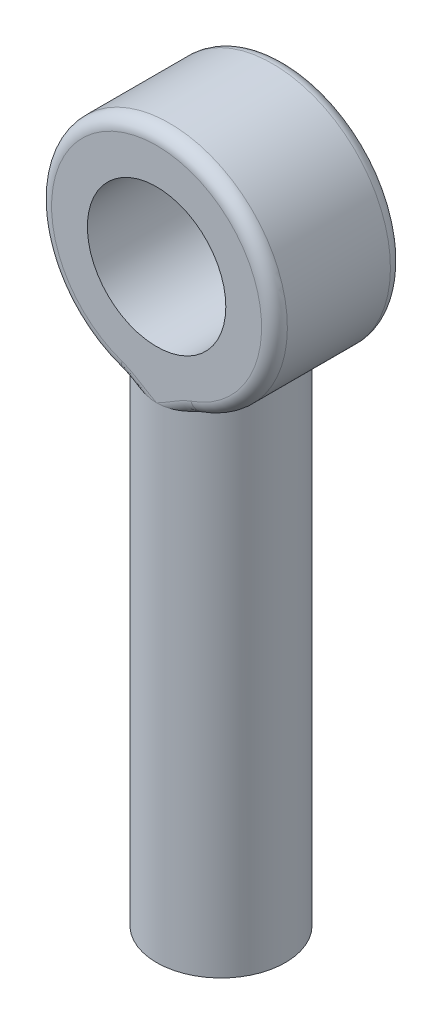
ISO-10303-21;
HEADER;
FILE_DESCRIPTION(('STEP AP214'),'2;1');
FILE_NAME('part.step','',(''),(''),'','','');
FILE_SCHEMA(('AUTOMOTIVE_DESIGN { 1 0 10303 214 1 1 1 1 }'));
ENDSEC;
DATA;
#1=APPLICATION_CONTEXT('core data for automotive mechanical design processes');
#2=APPLICATION_PROTOCOL_DEFINITION('international standard','automotive_design',2000,#1);
#3=PRODUCT_CONTEXT('',#1,'mechanical');
#4=PRODUCT('Part','Part','',(#3));
#5=PRODUCT_RELATED_PRODUCT_CATEGORY('part','',(#4));
#6=PRODUCT_DEFINITION_FORMATION('','',#4);
#7=PRODUCT_DEFINITION_CONTEXT('part definition',#1,'design');
#8=PRODUCT_DEFINITION('design','',#6,#7);
#9=PRODUCT_DEFINITION_SHAPE('','',#8);
#10=(LENGTH_UNIT() NAMED_UNIT(*) SI_UNIT(.MILLI.,.METRE.));
#11=(NAMED_UNIT(*) PLANE_ANGLE_UNIT() SI_UNIT($,.RADIAN.));
#12=(NAMED_UNIT(*) SI_UNIT($,.STERADIAN.) SOLID_ANGLE_UNIT());
#13=UNCERTAINTY_MEASURE_WITH_UNIT(LENGTH_MEASURE(1.E-05),#10,'distance_accuracy_value','');
#14=(GEOMETRIC_REPRESENTATION_CONTEXT(3) GLOBAL_UNCERTAINTY_ASSIGNED_CONTEXT((#13)) GLOBAL_UNIT_ASSIGNED_CONTEXT((#10,
#11,#12)) REPRESENTATION_CONTEXT('',''));
#15=CARTESIAN_POINT('',(0.,0.,0.));
#16=DIRECTION('',(0.,0.,1.));
#17=DIRECTION('',(1.,0.,0.));
#18=AXIS2_PLACEMENT_3D('',#15,#16,#17);
#19=CARTESIAN_POINT('',(0.,8.,0.));
#20=DIRECTION('',(0.,-1.,0.));
#21=DIRECTION('',(0.,0.,-1.));
#22=AXIS2_PLACEMENT_3D('',#19,#20,#21);
#23=CYLINDRICAL_SURFACE('',#22,1.);
#24=CARTESIAN_POINT('',(0.,0.,0.));
#25=DIRECTION('',(0.,1.,0.));
#26=DIRECTION('',(0.,0.,1.));
#27=AXIS2_PLACEMENT_3D('',#24,#25,#26);
#28=CIRCLE('',#27,1.);
#29=CARTESIAN_POINT('',(0.,0.,1.));
#30=VERTEX_POINT('',#29);
#31=EDGE_CURVE('E125',#30,#30,#28,.T.);
#32=ORIENTED_EDGE('',*,*,#31,.T.);
#33=EDGE_LOOP('',(#32));
#34=FACE_BOUND('',#33,.T.);
#35=CARTESIAN_POINT('',(0.,7.52698641016358,-1.));
#36=CARTESIAN_POINT('',(-0.051970467917206,7.52698938291042,-0.999996699192172));
#37=CARTESIAN_POINT('',(-0.103984471064199,7.52922235900575,-0.995925169987836));
#38=CARTESIAN_POINT('',(-0.206437472747701,7.53793520037049,-0.979837527700244));
#39=CARTESIAN_POINT('',(-0.256874152359671,7.5444210364042,-0.967810244999845));
#40=CARTESIAN_POINT('',(-0.354542477542119,7.56097025968291,-0.936440196531651));
#41=CARTESIAN_POINT('',(-0.401786352812405,7.57101895197488,-0.917127458906014));
#42=CARTESIAN_POINT('',(-0.492270636592457,7.59380495262617,-0.871911976068812));
#43=CARTESIAN_POINT('',(-0.535510906765449,7.60654235383875,-0.846009003260324));
#44=CARTESIAN_POINT('',(-0.620076371309741,7.63459913269445,-0.786360365241172));
#45=CARTESIAN_POINT('',(-0.661069830068739,7.65003535713016,-0.752200305728966));
#46=CARTESIAN_POINT('',(-0.737059368691457,7.681434659417,-0.67791673476889));
#47=CARTESIAN_POINT('',(-0.772049920876368,7.69739820688806,-0.637787789768385));
#48=CARTESIAN_POINT('',(-0.838463260883695,7.72985610156799,-0.548076339619698));
#49=CARTESIAN_POINT('',(-0.869212026226135,7.74625205159681,-0.497954618789555));
#50=CARTESIAN_POINT('',(-0.921723725949831,7.77570318302421,-0.392297672555958));
#51=CARTESIAN_POINT('',(-0.943493733992661,7.78876099118873,-0.336766751442518));
#52=CARTESIAN_POINT('',(-0.975890217291191,7.8087191410274,-0.225354249835977));
#53=CARTESIAN_POINT('',(-0.987132878735899,7.81595587141412,-0.169715643426276));
#54=CARTESIAN_POINT('',(-0.999985404405095,7.82425751292487,-0.0569139156552565));
#55=CARTESIAN_POINT('',(-1.00160869538649,7.82533102662681,0.000246968829507787));
#56=CARTESIAN_POINT('',(-0.995625620976603,7.82144338644309,0.105226410345113));
#57=CARTESIAN_POINT('',(-0.989363769846377,7.81736105038489,0.15316323244546));
#58=CARTESIAN_POINT('',(-0.970163088934987,7.80519470866099,0.247154754076427));
#59=CARTESIAN_POINT('',(-0.95722130153155,7.79710893048772,0.293208610145247));
#60=CARTESIAN_POINT('',(-0.924851319868638,7.77770425016732,0.3834034114977));
#61=CARTESIAN_POINT('',(-0.905287930561571,7.76631873689582,0.427480807196744));
#62=CARTESIAN_POINT('',(-0.860345668078355,7.74157543692857,0.511954127959286));
#63=CARTESIAN_POINT('',(-0.83496426678474,7.72821679374308,0.552348441905667));
#64=CARTESIAN_POINT('',(-0.774527595210986,7.69853566052023,0.634913195323332));
#65=CARTESIAN_POINT('',(-0.738582050453677,7.68207511876676,0.676384790650869));
#66=CARTESIAN_POINT('',(-0.660260443410964,7.649689743531,0.753034559801633));
#67=CARTESIAN_POINT('',(-0.617880124293626,7.63376527326243,0.788208533706892));
#68=CARTESIAN_POINT('',(-0.524438055404394,7.60299005981319,0.85347407334274));
#69=CARTESIAN_POINT('',(-0.472989964263161,7.58827749232008,0.883083288255684));
#70=CARTESIAN_POINT('',(-0.364844600395099,7.56285867798089,0.932965515524969));
#71=CARTESIAN_POINT('',(-0.308152267457337,7.5521487078926,0.953247208473617));
#72=CARTESIAN_POINT('',(-0.196730569434103,7.53680211015136,0.981985151095201));
#73=CARTESIAN_POINT('',(-0.14230416369101,7.53169559480773,0.991361207445898));
#74=CARTESIAN_POINT('',(-0.0324244358643851,7.52644937134694,1.00099165357989));
#75=CARTESIAN_POINT('',(0.0230282226244078,7.52630655865186,1.00125174499957));
#76=CARTESIAN_POINT('',(0.127684698427435,7.53076626232704,0.993068383464773));
#77=CARTESIAN_POINT('',(0.176976664506204,7.53491380638172,0.98545942536891));
#78=CARTESIAN_POINT('',(0.273458287191321,7.54687543939344,0.963157611001541));
#79=CARTESIAN_POINT('',(0.3206477292934,7.55468990152418,0.948464033740671));
#80=CARTESIAN_POINT('',(0.412885307254282,7.57352473422744,0.912162377033642));
#81=CARTESIAN_POINT('',(0.457859019409099,7.58461484566986,0.890402732666069));
#82=CARTESIAN_POINT('',(0.543637098919117,7.6090096456642,0.840783429178754));
#83=CARTESIAN_POINT('',(0.584439910073174,7.62231515596931,0.81292150533944));
#84=CARTESIAN_POINT('',(0.665543364916757,7.65166477699754,0.748350920584621));
#85=CARTESIAN_POINT('',(0.705285230165129,7.66784892826385,0.711003473358394));
#86=CARTESIAN_POINT('',(0.778238276105723,7.70018409722803,0.630323486420606));
#87=CARTESIAN_POINT('',(0.811442812978245,7.71633506487896,0.586984933349329));
#88=CARTESIAN_POINT('',(0.872827989689509,7.74808953647928,0.491555103527454));
#89=CARTESIAN_POINT('',(0.900441525904467,7.76356008097536,0.439050362311091));
#90=CARTESIAN_POINT('',(0.946172896845595,7.79027055379196,0.329074110618256));
#91=CARTESIAN_POINT('',(0.96430452026542,7.80151661864696,0.271609954750944));
#92=CARTESIAN_POINT('',(0.988746977932643,7.81694509901419,0.159231989476085));
#93=CARTESIAN_POINT('',(0.996036338284141,7.82170834999322,0.104614082687772));
#94=CARTESIAN_POINT('',(1.00149393822094,7.82525927171374,-0.00525209541912336));
#95=CARTESIAN_POINT('',(0.999669617721782,7.82405181662453,-0.0604998158397739));
#96=CARTESIAN_POINT('',(0.987902635514842,7.81645445834631,-0.162227296221264));
#97=CARTESIAN_POINT('',(0.979070365259631,7.81077414419967,-0.208897031126663));
#98=CARTESIAN_POINT('',(0.955104528961739,7.79586150542284,-0.299991443222223));
#99=CARTESIAN_POINT('',(0.939968436963116,7.78662775703616,-0.344415212437871));
#100=CARTESIAN_POINT('',(0.90281533797864,7.76496797453777,-0.432859846949563));
#101=CARTESIAN_POINT('',(0.880429556075247,7.75237937360748,-0.476684563723124));
#102=CARTESIAN_POINT('',(0.829765555623059,7.72561104285569,-0.560249707394681));
#103=CARTESIAN_POINT('',(0.801484193630807,7.71143046608312,-0.599987938486107));
#104=CARTESIAN_POINT('',(0.734753030294491,7.68046475819649,-0.680649048253896));
#105=CARTESIAN_POINT('',(0.695407817481397,7.66361506604281,-0.720810465850663));
#106=CARTESIAN_POINT('',(0.610232944498177,7.63109939708826,-0.794215012650451));
#107=CARTESIAN_POINT('',(0.564398773118372,7.61543425552505,-0.827453288727932));
#108=CARTESIAN_POINT('',(0.465536466667903,7.58640284033048,-0.886966934416858));
#109=CARTESIAN_POINT('',(0.412323624258422,7.57312728913857,-0.912982379072167));
#110=CARTESIAN_POINT('',(0.301378664188837,7.55108881005497,-0.955340166973844));
#111=CARTESIAN_POINT('',(0.243658692040336,7.54231420603317,-0.97170755536368));
#112=CARTESIAN_POINT('',(0.154384977744775,7.53325124269856,-0.988495801048371));
#113=CARTESIAN_POINT('',(0.12371976725997,7.53091106263287,-0.992800711559536));
#114=CARTESIAN_POINT('',(0.062041542368569,7.52777776444402,-0.99855378622909));
#115=CARTESIAN_POINT('',(0.0310285304389451,7.5269846353101,-1.00000197071953));
#116=CARTESIAN_POINT('',(0.,7.52698641016358,-1.));
#117=B_SPLINE_CURVE_WITH_KNOTS('',3,(#35,#36,#37,#38,#39,#40,#41,#42,#43,#44,#45,#46,#47,#48,
#49,#50,#51,#52,#53,#54,#55,#56,#57,#58,#59,#60,#61,#62,#63,#64,#65,#66,#67,#68,#69,#70,#71,#72,
#73,#74,#75,#76,#77,#78,#79,#80,#81,#82,#83,#84,#85,#86,#87,#88,#89,#90,#91,#92,#93,#94,#95,#96,
#97,#98,#99,#100,#101,#102,#103,#104,#105,#106,#107,#108,#109,#110,#111,#112,#113,#114,#115,
#116),.UNSPECIFIED.,.T.,.F.,(4,2,2,2,2,2,2,2,2,2,2,2,2,2,2,2,2,2,2,2,2,2,2,2,2,2,2,2,2,2,2,2,2,
2,2,2,2,2,2,2,4),(0.,0.155786430819204,0.311792046230735,0.467161563596198,0.622536447450762,
0.788508029006407,0.954631631892104,1.13684873456602,1.31892200713352,1.48951276710349,
1.65986535959731,1.80473150579211,1.94966184830995,2.09775024883125,2.24590312102722,
2.41707022348151,2.58835105642325,2.77082510381357,2.95312898766059,3.1185813126271,
3.28393015257035,3.43337967802993,3.58284441591883,3.73575413342211,3.88872069627475,
4.05867144960494,4.22879404054062,4.41173588030745,4.59441093917223,4.75931125979861,
4.9240769867412,5.0669598655619,5.20990005305148,5.36171228414045,5.51360566744169,
5.68891075036996,5.86433831170484,6.04543884344395,6.22606716671143,6.31907880598098,
6.41208978326041),.UNSPECIFIED.);
#118=CARTESIAN_POINT('',(0.,7.52698641016358,-1.));
#119=VERTEX_POINT('',#118);
#120=CARTESIAN_POINT('',(-0.600000000000304,7.62811701872746,-0.8));
#121=VERTEX_POINT('',#120);
#122=EDGE_CURVE('E106',#119,#121,#117,.T.);
#123=ORIENTED_EDGE('',*,*,#122,.F.);
#124=CARTESIAN_POINT('',(0.6,7.62811701872736,-0.8));
#125=VERTEX_POINT('',#124);
#126=EDGE_CURVE('E108',#125,#119,#117,.T.);
#127=ORIENTED_EDGE('',*,*,#126,.F.);
#128=CARTESIAN_POINT('',(0.600000000000029,7.62811701872736,0.8));
#129=VERTEX_POINT('',#128);
#130=EDGE_CURVE('E124',#129,#125,#117,.T.);
#131=ORIENTED_EDGE('',*,*,#130,.F.);
#132=CARTESIAN_POINT('',(0.,7.52698641016318,1.00000000000073));
#133=VERTEX_POINT('',#132);
#134=EDGE_CURVE('E116',#133,#129,#117,.T.);
#135=ORIENTED_EDGE('',*,*,#134,.F.);
#136=CARTESIAN_POINT('',(-0.600000000000587,7.62811701872756,0.8));
#137=VERTEX_POINT('',#136);
#138=EDGE_CURVE('E126',#137,#133,#117,.T.);
#139=ORIENTED_EDGE('',*,*,#138,.F.);
#140=EDGE_CURVE('E111',#121,#137,#117,.T.);
#141=ORIENTED_EDGE('',*,*,#140,.F.);
#142=EDGE_LOOP('',(#123,#127,#131,#135,#139,#141));
#143=FACE_BOUND('',#142,.T.);
#144=ADVANCED_FACE('F34',(#34,#143),#23,.T.);
#145=CARTESIAN_POINT('',(0.,0.,0.));
#146=DIRECTION('',(0.,1.,0.));
#147=DIRECTION('',(0.,0.,1.));
#148=AXIS2_PLACEMENT_3D('',#145,#146,#147);
#149=PLANE('',#148);
#150=ORIENTED_EDGE('',*,*,#31,.F.);
#151=EDGE_LOOP('',(#150));
#152=FACE_BOUND('',#151,.T.);
#153=ADVANCED_FACE('F296',(#152),#149,.F.);
#154=CARTESIAN_POINT('',(0.,9.35742827759776,1.));
#155=DIRECTION('',(0.,0.,-1.));
#156=DIRECTION('',(-1.,0.,0.));
#157=AXIS2_PLACEMENT_3D('',#154,#155,#156);
#158=CYLINDRICAL_SURFACE('',#157,1.83044186743419);
#159=ORIENTED_EDGE('',*,*,#130,.T.);
#160=CARTESIAN_POINT('',(0.,9.35742827759776,-0.8));
#161=DIRECTION('',(0.,0.,1.));
#162=DIRECTION('',(1.,0.,0.));
#163=AXIS2_PLACEMENT_3D('',#160,#161,#162);
#164=CIRCLE('',#163,1.83044186743419);
#165=EDGE_CURVE('E100',#125,#121,#164,.T.);
#166=ORIENTED_EDGE('',*,*,#165,.T.);
#167=ORIENTED_EDGE('',*,*,#140,.T.);
#168=CARTESIAN_POINT('',(0.,9.35742827759776,0.8));
#169=DIRECTION('',(0.,0.,1.));
#170=DIRECTION('',(1.,0.,0.));
#171=AXIS2_PLACEMENT_3D('',#168,#169,#170);
#172=CIRCLE('',#171,1.83044186743419);
#173=EDGE_CURVE('E114',#137,#129,#172,.F.);
#174=ORIENTED_EDGE('',*,*,#173,.T.);
#175=EDGE_LOOP('',(#159,#166,#167,#174));
#176=FACE_BOUND('',#175,.T.);
#177=ADVANCED_FACE('F141',(#176),#158,.T.);
#178=CARTESIAN_POINT('',(0.,9.35742827759776,1.));
#179=DIRECTION('',(0.,0.,1.));
#180=DIRECTION('',(1.,0.,0.));
#181=AXIS2_PLACEMENT_3D('',#178,#179,#180);
#182=PLANE('',#181);
#183=CARTESIAN_POINT('',(0.,7.52698641016358,1.));
#184=CARTESIAN_POINT('',(-9.77387525553122E-12,7.52698641016358,1.));
#185=CARTESIAN_POINT('',(-1.95477505110625E-11,7.52698641016357,1.));
#186=CARTESIAN_POINT('',(-0.00168654811929439,7.52782968043313,1.));
#187=CARTESIAN_POINT('',(-0.00189552876347099,7.52740787804781,1.));
#188=CARTESIAN_POINT('',(-0.00210450064190155,7.52698614702818,1.00000019812365));
#189=CARTESIAN_POINT('',(-0.003371641051788,7.52867587043769,1.));
#190=CARTESIAN_POINT('',(-0.00379147665539922,7.52783270798792,1.));
#191=CARTESIAN_POINT('',(-0.00421124223419119,7.5269895936486,0.999993648469634));
#192=CARTESIAN_POINT('',(-0.0348248089523387,7.54453739401447,1.));
#193=CARTESIAN_POINT('',(-0.0392264716648263,7.53583202088697,1.));
#194=CARTESIAN_POINT('',(-0.0436072753622978,7.52712335111166,0.999744978863896));
#195=CARTESIAN_POINT('',(-0.0641457199831848,7.56044468499952,1.));
#196=CARTESIAN_POINT('',(-0.0730439225046229,7.54446138067876,1.));
#197=CARTESIAN_POINT('',(-0.0815480134024022,7.52841084736441,0.997395782116366));
#198=CARTESIAN_POINT('',(-0.122130508356827,7.5934218654303,1.));
#199=CARTESIAN_POINT('',(-0.140279184462998,7.56261878902605,1.));
#200=CARTESIAN_POINT('',(-0.157092925196516,7.53334805171312,0.98831670074712));
#201=CARTESIAN_POINT('',(-0.150794016112644,7.61049238841147,1.));
#202=CARTESIAN_POINT('',(-0.174077472313793,7.57226195588071,1.));
#203=CARTESIAN_POINT('',(-0.19469690272043,7.53699905640594,0.981584411593583));
#204=CARTESIAN_POINT('',(-0.207955551314903,7.64508589936665,1.));
#205=CARTESIAN_POINT('',(-0.241359514145556,7.59116211471078,1.));
#206=CARTESIAN_POINT('',(-0.26825597666676,7.54637438933696,0.964084745545151));
#207=CARTESIAN_POINT('',(-0.236452863783847,7.66261004954365,1.));
#208=CARTESIAN_POINT('',(-0.275230550478996,7.60051981532386,1.));
#209=CARTESIAN_POINT('',(-0.304206008755181,7.55210466248382,0.953305795610457));
#210=CARTESIAN_POINT('',(-0.29366651382341,7.69727880907923,1.));
#211=CARTESIAN_POINT('',(-0.342423906888233,7.61727959692922,1.));
#212=CARTESIAN_POINT('',(-0.373046172815186,7.56505820899834,0.928538193829815));
#213=CARTESIAN_POINT('',(-0.322382756559033,7.71442357147172,1.));
#214=CARTESIAN_POINT('',(-0.376124344409935,7.62470803509856,1.));
#215=CARTESIAN_POINT('',(-0.405937556356567,7.57228086776331,0.914550863017171));
#216=CARTESIAN_POINT('',(-0.381348153733825,7.74779752720824,1.));
#217=CARTESIAN_POINT('',(-0.44354852270475,7.63584254931148,1.));
#218=CARTESIAN_POINT('',(-0.468729776010433,7.58771617245239,0.88404813335428));
#219=CARTESIAN_POINT('',(-0.41161774644579,7.76399154551372,1.));
#220=CARTESIAN_POINT('',(-0.477564871358947,7.6392877686049,1.));
#221=CARTESIAN_POINT('',(-0.498531194787169,7.59594960066312,0.867476679472627));
#222=CARTESIAN_POINT('',(-0.473350541782452,7.79354464146294,1.));
#223=CARTESIAN_POINT('',(-0.543118356194995,7.63945870966179,1.));
#224=CARTESIAN_POINT('',(-0.553591018118684,7.61247216690315,0.833412829832937));
#225=CARTESIAN_POINT('',(-0.504805682745556,7.80691982299702,1.));
#226=CARTESIAN_POINT('',(-0.574903184937714,7.63573900558596,1.));
#227=CARTESIAN_POINT('',(-0.578875096254024,7.62076069301944,0.815926419772173));
#228=CARTESIAN_POINT('',(-0.559234734289879,7.82556650539757,1.));
#229=CARTESIAN_POINT('',(-0.62262974391208,7.62127719296923,1.));
#230=CARTESIAN_POINT('',(-0.617690060355261,7.6342754531923,0.78667175272099));
#231=CARTESIAN_POINT('',(-0.581766569799328,7.83206372059331,1.));
#232=CARTESIAN_POINT('',(-0.640758326862257,7.61257261705014,1.));
#233=CARTESIAN_POINT('',(-0.632417136396313,7.63964530302853,0.774833874504411));
#234=CARTESIAN_POINT('',(-0.627742213328245,7.84194824275603,1.));
#235=CARTESIAN_POINT('',(-0.671223263650764,7.58966290015831,1.));
#236=CARTESIAN_POINT('',(-0.659841298964129,7.64999179562984,0.751624526063452));
#237=CARTESIAN_POINT('',(-0.651193374733674,7.84530017670787,1.));
#238=CARTESIAN_POINT('',(-0.683076902154961,7.57493879075499,1.));
#239=CARTESIAN_POINT('',(-0.672514000048021,7.65496340390726,0.740259703282654));
#240=CARTESIAN_POINT('',(-0.674915369831935,7.84652303426865,1.));
#241=CARTESIAN_POINT('',(-0.689015266115583,7.55771879285645,1.));
#242=CARTESIAN_POINT('',(-0.684041077564358,7.65960370904863,0.729442393869346));
#243=(BOUNDED_SURFACE() B_SPLINE_SURFACE(3,2,((#183,#184,#185),(#186,#187,#188),(#189,#190,
#191),(#192,#193,#194),(#195,#196,#197),(#198,#199,#200),(#201,#202,#203),(#204,#205,#206),
(#207,#208,#209),(#210,#211,#212),(#213,#214,#215),(#216,#217,#218),(#219,#220,#221),(#222,#223,
#224),(#225,#226,#227),(#228,#229,#230),(#231,#232,#233),(#234,#235,#236),(#237,#238,#239),
(#240,#241,#242)),.UNSPECIFIED.,.F.,.F.,.F.) B_SPLINE_SURFACE_WITH_KNOTS((4,2,2,2,2,2,2,2,2,4),
(3,3),(0.,0.00565686259358751,0.105678377575268,0.205754809902558,0.306119658371052,
0.40644325610641,0.509363060985981,0.611677917776606,0.681831176715021,0.752764268849145),(0.,
1.),.UNSPECIFIED.) GEOMETRIC_REPRESENTATION_ITEM() RATIONAL_B_SPLINE_SURFACE(((1.,1.,1.),(1.,
1.00000006196318,1.),(1.,0.999991747522638,1.),(1.,0.999679360102642,1.),(1.,0.996755271709692,
1.),(1.,0.98530487003735,1.),(1.,0.976775481708042,1.),(1.,0.954117000821686,1.),(1.,
0.939971840990942,1.),(1.,0.906435465402421,1.),(1.,0.887046408203926,1.),(1.,0.842981160016293,
1.),(1.,0.818181131453455,1.),(1.,0.764363520458414,1.),(1.,0.735371585034437,1.),(1.,
0.683462075146073,1.),(1.,0.661499762190992,1.),(1.,0.616112203299446,1.),(1.,0.592673409050226,
1.),(1.,0.568864712996651,1.))) REPRESENTATION_ITEM('') SURFACE());
#244=CARTESIAN_POINT('',(-0.674915369831935,7.84652303426865,1.));
#245=CARTESIAN_POINT('',(-0.651193374733674,7.84530017670787,1.));
#246=CARTESIAN_POINT('',(-0.627742213328245,7.84194824275603,1.));
#247=CARTESIAN_POINT('',(-0.581766569799328,7.83206372059331,1.));
#248=CARTESIAN_POINT('',(-0.559234734289879,7.82556650539757,1.));
#249=CARTESIAN_POINT('',(-0.504805682745556,7.80691982299702,1.));
#250=CARTESIAN_POINT('',(-0.473350541782451,7.79354464146294,1.));
#251=CARTESIAN_POINT('',(-0.41161774644579,7.76399154551372,1.));
#252=CARTESIAN_POINT('',(-0.381348153733825,7.74779752720824,1.));
#253=CARTESIAN_POINT('',(-0.322382756559033,7.71442357147172,1.));
#254=CARTESIAN_POINT('',(-0.29366651382341,7.69727880907923,1.));
#255=CARTESIAN_POINT('',(-0.236452863783847,7.66261004954365,1.));
#256=CARTESIAN_POINT('',(-0.207955551314903,7.64508589936665,1.));
#257=CARTESIAN_POINT('',(-0.150794016112644,7.61049238841147,1.));
#258=CARTESIAN_POINT('',(-0.122130508356827,7.5934218654303,1.));
#259=CARTESIAN_POINT('',(-0.0641457199831847,7.56044468499952,1.));
#260=CARTESIAN_POINT('',(-0.0348248089523386,7.54453739401447,1.));
#261=CARTESIAN_POINT('',(-0.003371641051788,7.52867587043769,1.));
#262=CARTESIAN_POINT('',(-0.00168654811929439,7.52782968043313,1.));
#263=CARTESIAN_POINT('',(0.,7.52698641016358,1.));
#264=B_SPLINE_CURVE_WITH_KNOTS('',3,(#244,#245,#246,#247,#248,#249,#250,#251,#252,#253,#254,
#255,#256,#257,#258,#259,#260,#261,#262,#263),.UNSPECIFIED.,.F.,.F.,(4,2,2,2,2,2,2,2,2,4),(0.,
0.070933092134124,0.141086351072539,0.243401207863163,0.346321012742735,0.446644610478093,
0.547009458946586,0.647085891273877,0.747107406255557,0.752764268849145),.UNSPECIFIED.);
#265=CARTESIAN_POINT('',(-0.534442058973068,7.81706716127277,1.));
#266=VERTEX_POINT('',#265);
#267=EDGE_CURVE('E119',#266,#133,#264,.T.);
#268=ORIENTED_EDGE('',*,*,#267,.T.);
#269=CARTESIAN_POINT('',(0.628555051553443,7.84152123020113,1.));
#270=CARTESIAN_POINT('',(0.669869099887204,7.58861173664064,1.));
#271=CARTESIAN_POINT('',(0.659834005704115,7.65004291296046,0.751412852221154));
#272=CARTESIAN_POINT('',(0.612095341844448,7.83881532849146,1.));
#273=CARTESIAN_POINT('',(0.661035211339228,7.59805414532398,1.));
#274=CARTESIAN_POINT('',(0.650653755869616,7.64649805458552,0.759475338512103));
#275=CARTESIAN_POINT('',(0.595809699545001,7.83524648976496,1.));
#276=CARTESIAN_POINT('',(0.65009043626449,7.60618472575125,1.));
#277=CARTESIAN_POINT('',(0.640923229415198,7.6428251706919,0.767719983534419));
#278=CARTESIAN_POINT('',(0.563648955913855,7.82671369217039,1.));
#279=CARTESIAN_POINT('',(0.625666647491144,7.61942605952106,1.));
#280=CARTESIAN_POINT('',(0.620402242248302,7.63529899239658,0.784394115593078));
#281=CARTESIAN_POINT('',(0.547772894643065,7.82175339612661,1.));
#282=CARTESIAN_POINT('',(0.612285851389527,7.62469271791165,1.));
#283=CARTESIAN_POINT('',(0.609614612088566,7.63144619349806,0.792823064471747));
#284=CARTESIAN_POINT('',(0.501109882996578,7.80538478026958,1.));
#285=CARTESIAN_POINT('',(0.57111042688971,7.63622223453405,1.));
#286=CARTESIAN_POINT('',(0.57592851768692,7.61979794462052,0.817976060634369));
#287=CARTESIAN_POINT('',(0.47088438322166,7.79240650336457,1.));
#288=CARTESIAN_POINT('',(0.540470003262296,7.63954683285599,1.));
#289=CARTESIAN_POINT('',(0.551481089803841,7.61182262029329,0.83477131174122));
#290=CARTESIAN_POINT('',(0.403636851983783,7.76010948859778,1.));
#291=CARTESIAN_POINT('',(0.469569240461098,7.6391464744309,1.));
#292=CARTESIAN_POINT('',(0.491338056720739,7.593816206447,0.871861764496758));
#293=CARTESIAN_POINT('',(0.367000670734485,7.74002620394324,1.));
#294=CARTESIAN_POINT('',(0.427807440144408,7.634019791082,1.));
#295=CARTESIAN_POINT('',(0.45439130558824,7.58381559372028,0.891867364226568));
#296=CARTESIAN_POINT('',(0.312797058376754,7.70861365868946,1.));
#297=CARTESIAN_POINT('',(0.36435163613661,7.62193185845425,1.));
#298=CARTESIAN_POINT('',(0.394699983119227,7.56992964669999,0.919073814719343));
#299=CARTESIAN_POINT('',(0.294842973168928,7.69792090266645,1.));
#300=CARTESIAN_POINT('',(0.343379883685246,7.61729061364879,1.));
#301=CARTESIAN_POINT('',(0.374076343662265,7.56548432259284,0.927680279776969));
#302=CARTESIAN_POINT('',(0.259050913470113,7.67634177559885,1.));
#303=CARTESIAN_POINT('',(0.301425383194692,7.60716924139202,1.));
#304=CARTESIAN_POINT('',(0.331568189901006,7.55713790515118,0.943702890339811));
#305=CARTESIAN_POINT('',(0.241212935065435,7.665455411127,1.));
#306=CARTESIAN_POINT('',(0.280352759082635,7.60168697127158,1.));
#307=CARTESIAN_POINT('',(0.309683718343934,7.55323679338103,0.951119076167994));
#308=CARTESIAN_POINT('',(0.205464983526913,7.64364218408839,1.));
#309=CARTESIAN_POINT('',(0.238237874733813,7.59029248040212,1.));
#310=CARTESIAN_POINT('',(0.26494991823239,7.54612844744727,0.964538459857571));
#311=CARTESIAN_POINT('',(0.18755500606375,7.6327153325521,1.));
#312=CARTESIAN_POINT('',(0.217097668940553,7.58436015109117,1.));
#313=CARTESIAN_POINT('',(0.242097100176414,7.54292403307181,0.970535923942568));
#314=CARTESIAN_POINT('',(0.151623040651832,7.61105051863947,1.));
#315=CARTESIAN_POINT('',(0.17485771107591,7.5724549866071,1.));
#316=CARTESIAN_POINT('',(0.195684577571796,7.53733147079898,0.980949054992624));
#317=CARTESIAN_POINT('',(0.13360106565931,7.60031253494518,1.));
#318=CARTESIAN_POINT('',(0.153663870479507,7.5664563489103,1.));
#319=CARTESIAN_POINT('',(0.172124953624748,7.53494323021009,0.985364901582144));
#320=CARTESIAN_POINT('',(0.0973402687596496,7.57923166355504,1.));
#321=CARTESIAN_POINT('',(0.111391477996623,7.55476788144326,1.));
#322=CARTESIAN_POINT('',(0.124778798405164,7.53108792500822,0.992476001736331));
#323=CARTESIAN_POINT('',(0.0791015920400216,7.56888852894856,1.));
#324=CARTESIAN_POINT('',(0.0902170781884099,7.54904886460023,1.));
#325=CARTESIAN_POINT('',(0.100992420957308,7.52962027555825,0.995172347690768));
#326=CARTESIAN_POINT('',(0.0515111806738347,7.5537986298793,1.));
#327=CARTESIAN_POINT('',(0.0584899138459818,7.54089873607438,1.));
#328=CARTESIAN_POINT('',(0.0653784732084564,7.52811552257373,0.997931470133008));
#329=CARTESIAN_POINT('',(0.0422753392407157,7.54883930922075,1.));
#330=CARTESIAN_POINT('',(0.047920679713526,7.53825308552585,1.));
#331=CARTESIAN_POINT('',(0.0535177080378043,7.52773005723563,0.998636946909721));
#332=CARTESIAN_POINT('',(0.0283759614733865,7.54148520955515,1.));
#333=CARTESIAN_POINT('',(0.0320898514060846,7.53439538342673,1.));
#334=CARTESIAN_POINT('',(0.0357897114032028,7.5273254034235,0.999377504615478));
#335=CARTESIAN_POINT('',(0.0237351059120529,7.53904792465274,1.));
#336=CARTESIAN_POINT('',(0.0268169409056246,7.53312795846489,1.));
#337=CARTESIAN_POINT('',(0.0298907445538254,7.52721944232952,0.99957141522932));
#338=CARTESIAN_POINT('',(0.0144033710811724,7.53427079366113,1.));
#339=CARTESIAN_POINT('',(0.0162434098181091,7.53066720284919,1.));
#340=CARTESIAN_POINT('',(0.0180806810159105,7.52706496287211,0.99985443278523));
#341=CARTESIAN_POINT('',(0.00971249068806815,7.53193094976626,1.));
#342=CARTESIAN_POINT('',(0.0109414009855989,7.52947352246685,1.));
#343=CARTESIAN_POINT('',(0.0121695840573491,7.52701644580161,0.999943537368331));
#344=CARTESIAN_POINT('',(0.00421753656331799,7.52909211202889,1.));
#345=CARTESIAN_POINT('',(0.00474245354369065,7.52804259279801,1.));
#346=CARTESIAN_POINT('',(0.00526732508419899,7.52699313051949,0.999986974183062));
#347=CARTESIAN_POINT('',(0.00338086400078482,7.52865716016743,1.));
#348=CARTESIAN_POINT('',(0.00379893486035577,7.52782381909124,1.));
#349=CARTESIAN_POINT('',(0.00421698321035026,7.52699050639027,0.999991904523076));
#350=CARTESIAN_POINT('',(0.00169928069971397,7.52780400618542,1.));
#351=CARTESIAN_POINT('',(0.00190611079068449,7.52739554964759,1.));
#352=CARTESIAN_POINT('',(0.0021129324441241,7.52698709112924,0.9999984351803));
#353=CARTESIAN_POINT('',(0.000854371331804979,7.52738580133535,1.));
#354=CARTESIAN_POINT('',(0.000956798294787761,7.52718605048091,1.));
#355=CARTESIAN_POINT('',(0.00105922413090796,7.52698629969751,1.00000003604235));
#356=CARTESIAN_POINT('',(0.,7.52698641016358,1.));
#357=CARTESIAN_POINT('',(0.,7.52698641016358,1.));
#358=CARTESIAN_POINT('',(0.,7.52698641016358,1.));
#359=(BOUNDED_SURFACE() B_SPLINE_SURFACE(3,2,((#269,#270,#271),(#272,#273,#274),(#275,#276,
#277),(#278,#279,#280),(#281,#282,#283),(#284,#285,#286),(#287,#288,#289),(#290,#291,#292),
(#293,#294,#295),(#296,#297,#298),(#299,#300,#301),(#302,#303,#304),(#305,#306,#307),(#308,#309,
#310),(#311,#312,#313),(#314,#315,#316),(#317,#318,#319),(#320,#321,#322),(#323,#324,#325),
(#326,#327,#328),(#329,#330,#331),(#332,#333,#334),(#335,#336,#337),(#338,#339,#340),(#341,#342,
#343),(#344,#345,#346),(#347,#348,#349),(#350,#351,#352),(#353,#354,#355),(#356,#357,#358)),
.UNSPECIFIED.,.F.,.F.,.F.) B_SPLINE_SURFACE_WITH_KNOTS((4,2,2,2,2,2,2,2,2,2,2,2,2,2,4),(3,3),
(0.,0.0499723442531492,0.0998143579137563,0.198275267045597,0.323500216812856,0.386193523184419,
0.448884705252894,0.511825083443753,0.574758311221119,0.637651517913281,0.669100172134599,
0.68482535596104,0.700550893721971,0.703379694985842,0.706208033301766),(0.,1.),
.UNSPECIFIED.) GEOMETRIC_REPRESENTATION_ITEM() RATIONAL_B_SPLINE_SURFACE(((1.,0.615253387392433,
1.),(1.,0.631637333315181,1.),(1.,0.647726472322365,1.),(1.,0.679138445216574,1.),(1.,
0.69446316823156,1.),(1.,0.738787582311972,1.),(1.,0.766544841805808,1.),(1.,0.825065317428096,
1.),(1.,0.85459468805431,1.),(1.,0.893224564717343,1.),(1.,0.905163022376859,1.),(1.,
0.927025791536372,1.),(1.,0.93695017127009,1.),(1.,0.954686073975649,1.),(1.,0.962489041576831,
1.),(1.,0.975918783091008,1.),(1.,0.981545804132263,1.),(1.,0.9905608146998,1.),(1.,
0.993950225816285,1.),(1.,0.997411438447864,1.),(1.,0.998294694322293,1.),(1.,0.99922173880579,
1.),(1.,0.999464448271153,1.),(1.,0.999817732924066,1.),(1.,0.999928305137481,1.),(1.,
0.999983432824789,1.),(1.,0.999989771517926,1.),(1.,0.999998150098951,1.),(1.,1.00000019069019,
1.),(1.,1.,1.))) REPRESENTATION_ITEM('') SURFACE());
#360=CARTESIAN_POINT('',(0.628555051553443,7.84152123020113,1.));
#361=CARTESIAN_POINT('',(0.612095341844448,7.83881532849146,1.));
#362=CARTESIAN_POINT('',(0.595809699545001,7.83524648976496,1.));
#363=CARTESIAN_POINT('',(0.563648955913855,7.82671369217039,1.));
#364=CARTESIAN_POINT('',(0.547772894643065,7.82175339612661,1.));
#365=CARTESIAN_POINT('',(0.501109882996578,7.80538478026958,1.));
#366=CARTESIAN_POINT('',(0.47088438322166,7.79240650336457,1.));
#367=CARTESIAN_POINT('',(0.403636851983783,7.76010948859778,1.));
#368=CARTESIAN_POINT('',(0.367000670734485,7.74002620394324,1.));
#369=CARTESIAN_POINT('',(0.312797058376754,7.70861365868946,1.));
#370=CARTESIAN_POINT('',(0.294842973168928,7.69792090266645,1.));
#371=CARTESIAN_POINT('',(0.259050913470113,7.67634177559886,1.));
#372=CARTESIAN_POINT('',(0.241212935065435,7.665455411127,1.));
#373=CARTESIAN_POINT('',(0.205464983526913,7.64364218408839,1.));
#374=CARTESIAN_POINT('',(0.18755500606375,7.6327153325521,1.));
#375=CARTESIAN_POINT('',(0.151623040651832,7.61105051863947,1.));
#376=CARTESIAN_POINT('',(0.13360106565931,7.60031253494518,1.));
#377=CARTESIAN_POINT('',(0.0973402687596496,7.57923166355504,1.));
#378=CARTESIAN_POINT('',(0.0791015920400216,7.56888852894856,1.));
#379=CARTESIAN_POINT('',(0.0515111806738347,7.5537986298793,1.));
#380=CARTESIAN_POINT('',(0.0422753392407157,7.54883930922075,1.));
#381=CARTESIAN_POINT('',(0.0283759614733865,7.54148520955515,1.));
#382=CARTESIAN_POINT('',(0.0237351059120529,7.53904792465274,1.));
#383=CARTESIAN_POINT('',(0.0144033710811724,7.53427079366113,1.));
#384=CARTESIAN_POINT('',(0.00971249068806813,7.53193094976626,1.));
#385=CARTESIAN_POINT('',(0.00421753656331799,7.52909211202889,1.));
#386=CARTESIAN_POINT('',(0.00338086400078483,7.52865716016743,1.));
#387=CARTESIAN_POINT('',(0.00169928069971398,7.52780400618542,1.));
#388=CARTESIAN_POINT('',(0.000854371331804991,7.52738580133535,1.));
#389=CARTESIAN_POINT('',(0.,7.52698641016358,1.));
#390=B_SPLINE_CURVE_WITH_KNOTS('',3,(#360,#361,#362,#363,#364,#365,#366,#367,#368,#369,#370,
#371,#372,#373,#374,#375,#376,#377,#378,#379,#380,#381,#382,#383,#384,#385,#386,#387,#388,#389),
.UNSPECIFIED.,.F.,.F.,(4,2,2,2,2,2,2,2,2,2,2,2,2,2,4),(0.,0.0499723442531492,0.0998143579137563,
0.198275267045597,0.323500216812856,0.386193523184419,0.448884705252894,0.511825083443753,
0.574758311221119,0.637651517913281,0.669100172134599,0.68482535596104,0.700550893721971,
0.703379694985842,0.706208033301766),.UNSPECIFIED.);
#391=CARTESIAN_POINT('',(0.534442058972261,7.81706716127349,1.));
#392=VERTEX_POINT('',#391);
#393=EDGE_CURVE('E11',#133,#392,#390,.F.);
#394=ORIENTED_EDGE('',*,*,#393,.T.);
#395=CARTESIAN_POINT('',(0.,9.35742827759776,1.));
#396=DIRECTION('',(0.,0.,1.));
#397=DIRECTION('',(1.,0.,0.));
#398=AXIS2_PLACEMENT_3D('',#395,#396,#397);
#399=CIRCLE('',#398,1.63044186743419);
#400=EDGE_CURVE('E49',#392,#266,#399,.T.);
#401=ORIENTED_EDGE('',*,*,#400,.T.);
#402=EDGE_LOOP('',(#268,#394,#401));
#403=FACE_BOUND('',#402,.T.);
#404=CARTESIAN_POINT('',(0.,9.35742827759776,1.));
#405=DIRECTION('',(0.,0.,1.));
#406=DIRECTION('',(1.,0.,0.));
#407=AXIS2_PLACEMENT_3D('',#404,#405,#406);
#408=CIRCLE('',#407,1.07469218975854);
#409=CARTESIAN_POINT('',(1.07469218975854,9.35742827759776,1.));
#410=VERTEX_POINT('',#409);
#411=EDGE_CURVE('E128',#410,#410,#408,.T.);
#412=ORIENTED_EDGE('',*,*,#411,.F.);
#413=EDGE_LOOP('',(#412));
#414=FACE_BOUND('',#413,.T.);
#415=ADVANCED_FACE('F236',(#403,#414),#182,.T.);
#416=CARTESIAN_POINT('',(0.,9.35742827759776,-1.));
#417=DIRECTION('',(0.,0.,1.));
#418=DIRECTION('',(1.,0.,0.));
#419=AXIS2_PLACEMENT_3D('',#416,#417,#418);
#420=PLANE('',#419);
#421=CARTESIAN_POINT('',(0.,7.52698641016358,-1.));
#422=CARTESIAN_POINT('',(9.77478722877171E-12,7.52698641016357,-1.));
#423=CARTESIAN_POINT('',(1.95495744575439E-11,7.52698641016357,-1.));
#424=CARTESIAN_POINT('',(0.00168654811929203,7.52782968043314,-1.));
#425=CARTESIAN_POINT('',(0.00189552876470077,7.52740787804784,-1.));
#426=CARTESIAN_POINT('',(0.00210450064425241,7.52698614702808,-1.00000019812386));
#427=CARTESIAN_POINT('',(0.00337164105178573,7.5286758704377,-1.));
#428=CARTESIAN_POINT('',(0.00379147665792393,7.52783270798795,-1.));
#429=CARTESIAN_POINT('',(0.00421124223913877,7.52698959364851,-0.999993648469816));
#430=CARTESIAN_POINT('',(0.0348248089547702,7.5445373940156,-1.));
#431=CARTESIAN_POINT('',(0.0392264716953246,7.53583202088721,-1.));
#432=CARTESIAN_POINT('',(0.0436072754222734,7.52712335111376,-0.999744978859792));
#433=CARTESIAN_POINT('',(0.0641457199886597,7.56044468500068,-1.));
#434=CARTESIAN_POINT('',(0.0730439225830398,7.54446138067235,-1.));
#435=CARTESIAN_POINT('',(0.0815480135736699,7.52841084740056,-0.99739578204536));
#436=CARTESIAN_POINT('',(0.122130508368884,7.59342186543528,-1.));
#437=CARTESIAN_POINT('',(0.140279184401801,7.56261878903453,-1.));
#438=CARTESIAN_POINT('',(0.157092925056607,7.53334805167901,-0.988316700814385));
#439=CARTESIAN_POINT('',(0.150794016128192,7.61049238842033,-1.));
#440=CARTESIAN_POINT('',(0.174077472034542,7.57226195590376,-1.));
#441=CARTESIAN_POINT('',(0.194696902157732,7.53699905626763,-0.981584411865872));
#442=CARTESIAN_POINT('',(0.207955551330655,7.64508589937673,-1.));
#443=CARTESIAN_POINT('',(0.241359514498104,7.59116211470549,-1.));
#444=CARTESIAN_POINT('',(0.26825597727233,7.54637438948092,-0.964084745262264));
#445=CARTESIAN_POINT('',(0.236452863796382,7.66261004955098,-1.));
#446=CARTESIAN_POINT('',(0.275230551813994,7.60051981530181,-1.));
#447=CARTESIAN_POINT('',(0.304206010958124,7.55210466301512,-0.953305794565684));
#448=CARTESIAN_POINT('',(0.293666513829601,7.6972788090823,-1.));
#449=CARTESIAN_POINT('',(0.342423905429678,7.61727959693046,-1.));
#450=CARTESIAN_POINT('',(0.373046170655171,7.56505820847517,-0.928538194859035));
#451=CARTESIAN_POINT('',(0.322382756562103,7.71442357147329,-1.));
#452=CARTESIAN_POINT('',(0.376124338591412,7.62470803505139,-1.));
#453=CARTESIAN_POINT('',(0.405937548239261,7.57228086579911,-0.914550866880722));
#454=CARTESIAN_POINT('',(0.381348153740037,7.74779752721193,-1.));
#455=CARTESIAN_POINT('',(0.443548515459444,7.6358425493454,-1.));
#456=CARTESIAN_POINT('',(0.46872976706701,7.58771617022242,-0.884048137780131));
#457=CARTESIAN_POINT('',(0.411617746458523,7.76399154552059,-1.));
#458=CARTESIAN_POINT('',(0.477564868266031,7.63928776888937,-1.));
#459=CARTESIAN_POINT('',(0.498531191264351,7.59594959967727,-0.867476681491825));
#460=CARTESIAN_POINT('',(0.473350541795788,7.79354464146855,-1.));
#461=CARTESIAN_POINT('',(0.543118359803115,7.639458709358,-1.));
#462=CARTESIAN_POINT('',(0.553591021661146,7.61247216789532,-0.833412827800642));
#463=CARTESIAN_POINT('',(0.504805682752397,7.80691982299936,-1.));
#464=CARTESIAN_POINT('',(0.574903190997375,7.63573900430907,-1.));
#465=CARTESIAN_POINT('',(0.578875101464926,7.6207606947484,-0.815926416091114));
#466=CARTESIAN_POINT('',(0.55923473428746,7.82556650539675,-1.));
#467=CARTESIAN_POINT('',(0.622629749508404,7.62127719092242,-1.));
#468=CARTESIAN_POINT('',(0.617690064555915,7.63427545471368,-0.786671749386081));
#469=CARTESIAN_POINT('',(0.581766569794408,7.83206372059189,-1.));
#470=CARTESIAN_POINT('',(0.640758330570486,7.61257261501567,-1.));
#471=CARTESIAN_POINT('',(0.632417139120188,7.63964530406135,-0.774833872181606));
#472=CARTESIAN_POINT('',(0.627742213323179,7.84194824275529,-1.));
#473=CARTESIAN_POINT('',(0.671223259363783,7.58966290255806,-1.));
#474=CARTESIAN_POINT('',(0.659841296189521,7.64999179457783,-0.751624528429391));
#475=CARTESIAN_POINT('',(0.651193374731107,7.84530017670772,-1.));
#476=CARTESIAN_POINT('',(0.68307689114941,7.57493879831847,-1.));
#477=CARTESIAN_POINT('',(0.672513993223087,7.65496340124662,-0.740259709354886));
#478=CARTESIAN_POINT('',(0.674915369831935,7.84652303426865,-1.));
#479=CARTESIAN_POINT('',(0.689015245754085,7.5577188110273,-1.));
#480=CARTESIAN_POINT('',(0.684041065203297,7.65960370406922,-0.729442405461909));
#481=(BOUNDED_SURFACE() B_SPLINE_SURFACE(3,2,((#421,#422,#423),(#424,#425,#426),(#427,#428,
#429),(#430,#431,#432),(#433,#434,#435),(#436,#437,#438),(#439,#440,#441),(#442,#443,#444),
(#445,#446,#447),(#448,#449,#450),(#451,#452,#453),(#454,#455,#456),(#457,#458,#459),(#460,#461,
#462),(#463,#464,#465),(#466,#467,#468),(#469,#470,#471),(#472,#473,#474),(#475,#476,#477),
(#478,#479,#480)),.UNSPECIFIED.,.F.,.F.,.F.) B_SPLINE_SURFACE_WITH_KNOTS((4,2,2,2,2,2,2,2,2,4),
(3,3),(0.,0.00565686259358751,0.105678377583302,0.205754809925479,0.306119658381455,
0.406443256106467,0.509363061007695,0.611677917776679,0.681831176707457,0.752764268849209),(0.,
1.),.UNSPECIFIED.) GEOMETRIC_REPRESENTATION_ITEM() RATIONAL_B_SPLINE_SURFACE(((1.,1.,1.),(1.,
1.00000006196348,1.),(1.,0.999991747522899,1.),(1.,0.999679360096876,1.),(1.,0.996755271608999,
1.),(1.,0.985304870134402,1.),(1.,0.976775482097595,1.),(1.,0.954117000418305,1.),(1.,
0.939971839499676,1.),(1.,0.906435466873144,1.),(1.,0.8870464137223,1.),(1.,0.842981166474369,
1.),(1.,0.81818113461432,1.),(1.,0.764363517276685,1.),(1.,0.73537157880785,1.),(1.,
0.683462069021088,1.),(1.,0.661499757566298,1.),(1.,0.616112208009425,1.),(1.,0.592673421664598,
1.),(1.,0.568864738469518,1.))) REPRESENTATION_ITEM('') SURFACE());
#482=CARTESIAN_POINT('',(0.674915369831935,7.84652303426865,-1.));
#483=CARTESIAN_POINT('',(0.651193374731107,7.84530017670772,-1.));
#484=CARTESIAN_POINT('',(0.627742213323179,7.84194824275529,-1.));
#485=CARTESIAN_POINT('',(0.581766569794408,7.83206372059189,-1.));
#486=CARTESIAN_POINT('',(0.55923473428746,7.82556650539675,-1.));
#487=CARTESIAN_POINT('',(0.504805682752397,7.80691982299936,-1.));
#488=CARTESIAN_POINT('',(0.473350541795788,7.79354464146855,-1.));
#489=CARTESIAN_POINT('',(0.411617746458523,7.76399154552059,-1.));
#490=CARTESIAN_POINT('',(0.381348153740037,7.74779752721193,-1.));
#491=CARTESIAN_POINT('',(0.322382756562103,7.71442357147329,-1.));
#492=CARTESIAN_POINT('',(0.293666513829602,7.69727880908231,-1.));
#493=CARTESIAN_POINT('',(0.236452863796382,7.66261004955098,-1.));
#494=CARTESIAN_POINT('',(0.207955551330655,7.64508589937673,-1.));
#495=CARTESIAN_POINT('',(0.150794016128192,7.61049238842033,-1.));
#496=CARTESIAN_POINT('',(0.122130508368884,7.59342186543528,-1.));
#497=CARTESIAN_POINT('',(0.0641457199886596,7.56044468500068,-1.));
#498=CARTESIAN_POINT('',(0.0348248089547701,7.5445373940156,-1.));
#499=CARTESIAN_POINT('',(0.00337164105178573,7.5286758704377,-1.));
#500=CARTESIAN_POINT('',(0.00168654811929203,7.52782968043314,-1.));
#501=CARTESIAN_POINT('',(0.,7.52698641016358,-1.));
#502=B_SPLINE_CURVE_WITH_KNOTS('',3,(#482,#483,#484,#485,#486,#487,#488,#489,#490,#491,#492,
#493,#494,#495,#496,#497,#498,#499,#500,#501),.UNSPECIFIED.,.F.,.F.,(4,2,2,2,2,2,2,2,2,4),(0.,
0.0709330921417527,0.141086351072531,0.243401207841514,0.346321012742742,0.446644610467754,
0.54700945892373,0.647085891265907,0.747107406255622,0.752764268849209),.UNSPECIFIED.);
#503=CARTESIAN_POINT('',(0.534442058972547,7.81706716127259,-1.));
#504=VERTEX_POINT('',#503);
#505=EDGE_CURVE('E88',#504,#119,#502,.T.);
#506=ORIENTED_EDGE('',*,*,#505,.T.);
#507=CARTESIAN_POINT('',(-0.628555051553593,7.84152123020115,-1.));
#508=CARTESIAN_POINT('',(-0.669869104694872,7.58861173369347,-1.));
#509=CARTESIAN_POINT('',(-0.659834008785194,7.65004291415025,-0.751412849515764));
#510=CARTESIAN_POINT('',(-0.612095341848713,7.83881532849204,-1.));
#511=CARTESIAN_POINT('',(-0.661035213455961,7.59805414423225,-1.));
#512=CARTESIAN_POINT('',(-0.650653757295811,7.64649805511223,-0.759475337332372));
#513=CARTESIAN_POINT('',(-0.595809699553241,7.83524648976664,-1.));
#514=CARTESIAN_POINT('',(-0.650090436924923,7.60618472544744,-1.));
#515=CARTESIAN_POINT('',(-0.640923229882184,7.64282517086001,-0.767719983161362));
#516=CARTESIAN_POINT('',(-0.563648955929386,7.82671369217486,-1.));
#517=CARTESIAN_POINT('',(-0.625666646926542,7.61942605977799,-1.));
#518=CARTESIAN_POINT('',(-0.620402241813064,7.6352989922401,-0.784394115940352));
#519=CARTESIAN_POINT('',(-0.547772894661922,7.82175339613273,-1.));
#520=CARTESIAN_POINT('',(-0.612285850916269,7.62469271803043,-1.));
#521=CARTESIAN_POINT('',(-0.60961461170764,7.63144619337459,-0.792823064735008));
#522=CARTESIAN_POINT('',(-0.501109883011048,7.80538478027598,-1.));
#523=CARTESIAN_POINT('',(-0.57111042767885,7.63622223433923,-1.));
#524=CARTESIAN_POINT('',(-0.575928518404859,7.6197979448525,-0.817976060140116));
#525=CARTESIAN_POINT('',(-0.470884383228917,7.79240650336805,-1.));
#526=CARTESIAN_POINT('',(-0.540470006033794,7.6395468325416,-1.));
#527=CARTESIAN_POINT('',(-0.55148109248862,7.61182262110191,-0.834771310071068));
#528=CARTESIAN_POINT('',(-0.403636851964384,7.76010948858847,-1.));
#529=CARTESIAN_POINT('',(-0.469569243219955,7.63914647415658,-1.));
#530=CARTESIAN_POINT('',(-0.491338059857764,7.59381620738088,-0.871861762579426));
#531=CARTESIAN_POINT('',(-0.367000670696373,7.74002620392267,-1.));
#532=CARTESIAN_POINT('',(-0.427807440561906,7.63401979102511,-1.));
#533=CARTESIAN_POINT('',(-0.454391306119753,7.58381559388155,-0.891867363894868));
#534=CARTESIAN_POINT('',(-0.312797058310891,7.70861365865121,-1.));
#535=CARTESIAN_POINT('',(-0.364351635859087,7.62193185846724,-1.));
#536=CARTESIAN_POINT('',(-0.394699982758379,7.56992964659722,-0.91907381492858));
#537=CARTESIAN_POINT('',(-0.294842973093796,7.69792090262214,-1.));
#538=CARTESIAN_POINT('',(-0.343379883551315,7.61729061363725,-1.));
#539=CARTESIAN_POINT('',(-0.374076343507635,7.56548432255151,-0.927680279859617));
#540=CARTESIAN_POINT('',(-0.259050913375867,7.67634177554196,-1.));
#541=CARTESIAN_POINT('',(-0.301425383127968,7.60716924135578,-1.));
#542=CARTESIAN_POINT('',(-0.331568189857675,7.55713790515362,-0.943702890331803));
#543=CARTESIAN_POINT('',(-0.241212934961349,7.66545541106358,-1.));
#544=CARTESIAN_POINT('',(-0.280352758956147,7.60168697123715,-1.));
#545=CARTESIAN_POINT('',(-0.309683718205649,7.55323679336584,-0.95111907619587));
#546=CARTESIAN_POINT('',(-0.205464983423098,7.64364218402496,-1.));
#547=CARTESIAN_POINT('',(-0.238237874623344,7.59029248037095,-1.));
#548=CARTESIAN_POINT('',(-0.264949918123188,7.54612844742313,-0.964538459903966));
#549=CARTESIAN_POINT('',(-0.187555005970047,7.63271533249519,-1.));
#550=CARTESIAN_POINT('',(-0.21709766890168,7.58436015106136,-1.));
#551=CARTESIAN_POINT('',(-0.242097100193024,7.54292403305565,-0.970535923973067));
#552=CARTESIAN_POINT('',(-0.151623040578415,7.61105051859559,-1.));
#553=CARTESIAN_POINT('',(-0.174857710927626,7.57245498658199,-1.));
#554=CARTESIAN_POINT('',(-0.19568457735584,7.53733147079111,-0.980949055006871));
#555=CARTESIAN_POINT('',(-0.133601065596067,7.60031253490783,-1.));
#556=CARTESIAN_POINT('',(-0.153663870154476,7.56645634888878,-1.));
#557=CARTESIAN_POINT('',(-0.172124953050469,7.53494323020254,-0.985364901596039));
#558=CARTESIAN_POINT('',(-0.09734026872714,7.57923166353676,-1.));
#559=CARTESIAN_POINT('',(-0.111391478221903,7.55476788143465,-1.));
#560=CARTESIAN_POINT('',(-0.124778798882716,7.53108792500793,-0.99247600173691));
#561=CARTESIAN_POINT('',(-0.0791015920282003,7.56888852894262,-1.));
#562=CARTESIAN_POINT('',(-0.0902170791329007,7.54904886460067,-1.));
#563=CARTESIAN_POINT('',(-0.100992422844036,7.52962027556437,-0.995172347679373));
#564=CARTESIAN_POINT('',(-0.0515111806915688,7.55379862988874,-1.));
#565=CARTESIAN_POINT('',(-0.0584899133896579,7.54089873607772,-1.));
#566=CARTESIAN_POINT('',(-0.0653784722813619,7.52811552257136,-0.99793147013744));
#567=CARTESIAN_POINT('',(-0.0422753392668212,7.54883930923418,-1.));
#568=CARTESIAN_POINT('',(-0.0479206783793194,7.53825308552821,-1.));
#569=CARTESIAN_POINT('',(-0.0535177053498053,7.52773005722741,-0.99863694692507));
#570=CARTESIAN_POINT('',(-0.0283759615018056,7.54148520957029,-1.));
#571=CARTESIAN_POINT('',(-0.0320898521171571,7.53439538343693,-1.));
#572=CARTESIAN_POINT('',(-0.0357897127952068,7.5273254034287,-0.999377504605803));
#573=CARTESIAN_POINT('',(-0.0237351059346166,7.53904792466522,-1.));
#574=CARTESIAN_POINT('',(-0.0268169428517673,7.53312795847788,-1.));
#575=CARTESIAN_POINT('',(-0.0298907484200273,7.52721944234288,-0.99957141520444));
#576=CARTESIAN_POINT('',(-0.014403371092967,7.53427079366639,-1.));
#577=CARTESIAN_POINT('',(-0.0162434079102131,7.53066720284541,-1.));
#578=CARTESIAN_POINT('',(-0.0180806771898206,7.52706496285927,-0.999854432809147));
#579=CARTESIAN_POINT('',(-0.00971249069494871,7.53193094976697,-1.));
#580=CARTESIAN_POINT('',(-0.0109413939912256,7.52947352244376,-1.));
#581=CARTESIAN_POINT('',(-0.012169570064485,7.52701644575443,-0.999943537456252));
#582=CARTESIAN_POINT('',(-0.00421753656388866,7.5290921120297,-1.));
#583=CARTESIAN_POINT('',(-0.00474245176285187,7.52804259279249,-1.));
#584=CARTESIAN_POINT('',(-0.00526732152211075,7.52699313050749,-0.999986974205422));
#585=CARTESIAN_POINT('',(-0.00338086400185888,7.52865716016918,-1.));
#586=CARTESIAN_POINT('',(-0.00379893418342762,7.52782381908987,-1.));
#587=CARTESIAN_POINT('',(-0.00421698185545211,7.52699050638572,-0.999991904531568));
#588=CARTESIAN_POINT('',(-0.00169928070063576,7.52780400618748,-1.));
#589=CARTESIAN_POINT('',(-0.00190611146306388,7.52739554965085,-1.));
#590=CARTESIAN_POINT('',(-0.00211293378798051,7.52698709113378,-0.999998435171843));
#591=CARTESIAN_POINT('',(-0.000854371332055537,7.5273858013368,-1.));
#592=CARTESIAN_POINT('',(-0.000956799212731581,7.52718605048467,-1.));
#593=CARTESIAN_POINT('',(-0.00105922596660269,7.52698629970371,-1.00000003603081));
#594=CARTESIAN_POINT('',(0.,7.52698641016358,-1.));
#595=CARTESIAN_POINT('',(0.,7.52698641016358,-1.));
#596=CARTESIAN_POINT('',(0.,7.52698641016358,-1.));
#597=(BOUNDED_SURFACE() B_SPLINE_SURFACE(3,2,((#507,#508,#509),(#510,#511,#512),(#513,#514,
#515),(#516,#517,#518),(#519,#520,#521),(#522,#523,#524),(#525,#526,#527),(#528,#529,#530),
(#531,#532,#533),(#534,#535,#536),(#537,#538,#539),(#540,#541,#542),(#543,#544,#545),(#546,#547,
#548),(#549,#550,#551),(#552,#553,#554),(#555,#556,#557),(#558,#559,#560),(#561,#562,#563),
(#564,#565,#566),(#567,#568,#569),(#570,#571,#572),(#573,#574,#575),(#576,#577,#578),(#579,#580,
#581),(#582,#583,#584),(#585,#586,#587),(#588,#589,#590),(#591,#592,#593),(#594,#595,#596)),
.UNSPECIFIED.,.F.,.F.,.F.) B_SPLINE_SURFACE_WITH_KNOTS((4,2,2,2,2,2,2,2,2,2,2,2,2,2,4),(3,3),
(0.,0.0499723442408023,0.0998143578904504,0.198275267045419,0.323500216878057,0.38619352328283,
0.448884705386694,0.511825083541479,0.574758311282602,0.637651517902575,0.6691001720961,
0.684825355941819,0.700550893722098,0.703379694983338,0.706208033301867),(0.,1.),
.UNSPECIFIED.) GEOMETRIC_REPRESENTATION_ITEM() RATIONAL_B_SPLINE_SURFACE(((1.,0.615253381896144,
1.),(1.,0.631637330997211,1.),(1.,0.647726471605146,1.),(1.,0.679138445885148,1.),(1.,
0.694463168689883,1.),(1.,0.738787581452046,1.),(1.,0.766544839147651,1.),(1.,0.825065314432578,
1.),(1.,0.854594687534019,1.),(1.,0.89322456503875,1.),(1.,0.905163022499288,1.),(1.,
0.927025791515248,1.),(1.,0.936950171304313,1.),(1.,0.954686074039597,1.),(1.,0.962489041617337,
1.),(1.,0.975918783108212,1.),(1.,0.981545804149611,1.),(1.,0.990560814700801,1.),(1.,
0.993950225802083,1.),(1.,0.997411438453378,1.),(1.,0.998294694341476,1.),(1.,0.999221738793695,
1.),(1.,0.999464448240047,1.),(1.,0.999817732953967,1.),(1.,0.999928305247403,1.),(1.,
0.999983432852735,1.),(1.,0.999989771528531,1.),(1.,0.999998150088368,1.),(1.,1.00000019067575,
1.),(1.,1.,1.))) REPRESENTATION_ITEM('') SURFACE());
#598=CARTESIAN_POINT('',(-0.628555051553593,7.84152123020115,-1.));
#599=CARTESIAN_POINT('',(-0.612095341848712,7.83881532849205,-1.));
#600=CARTESIAN_POINT('',(-0.595809699553241,7.83524648976664,-1.));
#601=CARTESIAN_POINT('',(-0.563648955929386,7.82671369217486,-1.));
#602=CARTESIAN_POINT('',(-0.547772894661922,7.82175339613272,-1.));
#603=CARTESIAN_POINT('',(-0.501109883011048,7.80538478027598,-1.));
#604=CARTESIAN_POINT('',(-0.470884383228917,7.79240650336805,-1.));
#605=CARTESIAN_POINT('',(-0.403636851964384,7.76010948858847,-1.));
#606=CARTESIAN_POINT('',(-0.367000670696373,7.74002620392267,-1.));
#607=CARTESIAN_POINT('',(-0.312797058310891,7.70861365865121,-1.));
#608=CARTESIAN_POINT('',(-0.294842973093796,7.69792090262214,-1.));
#609=CARTESIAN_POINT('',(-0.259050913375867,7.67634177554196,-1.));
#610=CARTESIAN_POINT('',(-0.241212934961349,7.66545541106358,-1.));
#611=CARTESIAN_POINT('',(-0.205464983423098,7.64364218402496,-1.));
#612=CARTESIAN_POINT('',(-0.187555005970047,7.63271533249519,-1.));
#613=CARTESIAN_POINT('',(-0.151623040578415,7.61105051859559,-1.));
#614=CARTESIAN_POINT('',(-0.133601065596067,7.60031253490783,-1.));
#615=CARTESIAN_POINT('',(-0.09734026872714,7.57923166353676,-1.));
#616=CARTESIAN_POINT('',(-0.0791015920282003,7.56888852894262,-1.));
#617=CARTESIAN_POINT('',(-0.0515111806915689,7.55379862988875,-1.));
#618=CARTESIAN_POINT('',(-0.0422753392668212,7.54883930923418,-1.));
#619=CARTESIAN_POINT('',(-0.0283759615018056,7.54148520957029,-1.));
#620=CARTESIAN_POINT('',(-0.0237351059346166,7.53904792466522,-1.));
#621=CARTESIAN_POINT('',(-0.014403371092967,7.53427079366639,-1.));
#622=CARTESIAN_POINT('',(-0.00971249069494877,7.53193094976697,-1.));
#623=CARTESIAN_POINT('',(-0.00421753656388867,7.5290921120297,-1.));
#624=CARTESIAN_POINT('',(-0.00338086400185889,7.52865716016918,-1.));
#625=CARTESIAN_POINT('',(-0.00169928070063576,7.52780400618748,-1.));
#626=CARTESIAN_POINT('',(-0.000854371332055543,7.5273858013368,-1.));
#627=CARTESIAN_POINT('',(0.,7.52698641016358,-1.));
#628=B_SPLINE_CURVE_WITH_KNOTS('',3,(#598,#599,#600,#601,#602,#603,#604,#605,#606,#607,#608,
#609,#610,#611,#612,#613,#614,#615,#616,#617,#618,#619,#620,#621,#622,#623,#624,#625,#626,#627),
.UNSPECIFIED.,.F.,.F.,(4,2,2,2,2,2,2,2,2,2,2,2,2,2,4),(0.,0.0499723442408023,0.0998143578904504,
0.198275267045419,0.323500216878057,0.38619352328283,0.448884705386694,0.511825083541479,
0.574758311282602,0.637651517902575,0.6691001720961,0.684825355941819,0.700550893722098,
0.703379694983338,0.706208033301867),.UNSPECIFIED.);
#629=CARTESIAN_POINT('',(-0.534442058972506,7.81706716127357,-1.));
#630=VERTEX_POINT('',#629);
#631=EDGE_CURVE('E93',#119,#630,#628,.F.);
#632=ORIENTED_EDGE('',*,*,#631,.T.);
#633=CARTESIAN_POINT('',(0.,9.35742827759776,-1.));
#634=DIRECTION('',(0.,0.,1.));
#635=DIRECTION('',(1.,0.,0.));
#636=AXIS2_PLACEMENT_3D('',#633,#634,#635);
#637=CIRCLE('',#636,1.63044186743419);
#638=EDGE_CURVE('E96',#630,#504,#637,.F.);
#639=ORIENTED_EDGE('',*,*,#638,.T.);
#640=EDGE_LOOP('',(#506,#632,#639));
#641=FACE_BOUND('',#640,.T.);
#642=CARTESIAN_POINT('',(0.,9.35742827759776,-1.));
#643=DIRECTION('',(0.,0.,1.));
#644=DIRECTION('',(1.,0.,0.));
#645=AXIS2_PLACEMENT_3D('',#642,#643,#644);
#646=CIRCLE('',#645,1.07469218975854);
#647=CARTESIAN_POINT('',(1.07469218975854,9.35742827759776,-1.));
#648=VERTEX_POINT('',#647);
#649=EDGE_CURVE('E281',#648,#648,#646,.T.);
#650=ORIENTED_EDGE('',*,*,#649,.T.);
#651=EDGE_LOOP('',(#650));
#652=FACE_BOUND('',#651,.T.);
#653=ADVANCED_FACE('F90',(#641,#652),#420,.F.);
#654=CARTESIAN_POINT('',(0.,9.35742827759776,1.));
#655=DIRECTION('',(0.,0.,-1.));
#656=DIRECTION('',(-1.,0.,0.));
#657=AXIS2_PLACEMENT_3D('',#654,#655,#656);
#658=CYLINDRICAL_SURFACE('',#657,1.07469218975854);
#659=ORIENTED_EDGE('',*,*,#411,.T.);
#660=EDGE_LOOP('',(#659));
#661=FACE_BOUND('',#660,.T.);
#662=ORIENTED_EDGE('',*,*,#649,.F.);
#663=EDGE_LOOP('',(#662));
#664=FACE_BOUND('',#663,.T.);
#665=ADVANCED_FACE('F206',(#661,#664),#658,.F.);
#666=ORIENTED_EDGE('',*,*,#631,.F.);
#667=ORIENTED_EDGE('',*,*,#122,.T.);
#668=CARTESIAN_POINT('',(-0.534442058972507,7.81706716127357,-0.8));
#669=DIRECTION('',(-0.944750712730749,0.327789705138435,0.));
#670=DIRECTION('',(-0.327789705138435,-0.944750712730749,0.));
#671=AXIS2_PLACEMENT_3D('',#668,#669,#670);
#672=CIRCLE('',#671,0.2);
#673=EDGE_CURVE('E118',#630,#121,#672,.T.);
#674=ORIENTED_EDGE('',*,*,#673,.F.);
#675=EDGE_LOOP('',(#666,#667,#674));
#676=FACE_BOUND('',#675,.T.);
#677=ADVANCED_FACE('F117',(#676),#597,.T.);
#678=CARTESIAN_POINT('',(0.,9.35742827759776,-0.8));
#679=DIRECTION('',(0.,0.,1.));
#680=DIRECTION('',(1.,0.,0.));
#681=AXIS2_PLACEMENT_3D('',#678,#679,#680);
#682=TOROIDAL_SURFACE('',#681,1.63044186743419,0.2);
#683=ORIENTED_EDGE('',*,*,#673,.T.);
#684=ORIENTED_EDGE('',*,*,#165,.F.);
#685=CARTESIAN_POINT('',(0.534442058972237,7.81706716127348,-0.8));
#686=DIRECTION('',(-0.944750712730616,-0.327789705138818,0.));
#687=DIRECTION('',(0.327789705138818,-0.944750712730616,0.));
#688=AXIS2_PLACEMENT_3D('',#685,#686,#687);
#689=CIRCLE('',#688,0.2);
#690=EDGE_CURVE('E122',#504,#125,#689,.T.);
#691=ORIENTED_EDGE('',*,*,#690,.F.);
#692=ORIENTED_EDGE('',*,*,#638,.F.);
#693=EDGE_LOOP('',(#683,#684,#691,#692));
#694=FACE_BOUND('',#693,.T.);
#695=ADVANCED_FACE('F172',(#694),#682,.T.);
#696=ORIENTED_EDGE('',*,*,#126,.T.);
#697=ORIENTED_EDGE('',*,*,#505,.F.);
#698=ORIENTED_EDGE('',*,*,#690,.T.);
#699=EDGE_LOOP('',(#696,#697,#698));
#700=FACE_BOUND('',#699,.T.);
#701=ADVANCED_FACE('F121',(#700),#481,.T.);
#702=ORIENTED_EDGE('',*,*,#138,.T.);
#703=ORIENTED_EDGE('',*,*,#267,.F.);
#704=CARTESIAN_POINT('',(-0.534442058973048,7.81706716127376,0.8));
#705=DIRECTION('',(0.944750712733923,-0.327789705129286,0.));
#706=DIRECTION('',(0.327789705129286,0.944750712733923,0.));
#707=AXIS2_PLACEMENT_3D('',#704,#705,#706);
#708=CIRCLE('',#707,0.2);
#709=EDGE_CURVE('E144',#137,#266,#708,.F.);
#710=ORIENTED_EDGE('',*,*,#709,.F.);
#711=EDGE_LOOP('',(#702,#703,#710));
#712=FACE_BOUND('',#711,.T.);
#713=ADVANCED_FACE('F145',(#712),#243,.T.);
#714=CARTESIAN_POINT('',(0.,9.35742827759776,0.8));
#715=DIRECTION('',(0.,0.,1.));
#716=DIRECTION('',(1.,0.,0.));
#717=AXIS2_PLACEMENT_3D('',#714,#715,#716);
#718=TOROIDAL_SURFACE('',#717,1.63044186743419,0.2);
#719=ORIENTED_EDGE('',*,*,#709,.T.);
#720=ORIENTED_EDGE('',*,*,#400,.F.);
#721=CARTESIAN_POINT('',(0.534442058972261,7.81706716127349,0.8));
#722=DIRECTION('',(-0.944750712730611,-0.327789705138833,0.));
#723=DIRECTION('',(0.327789705138833,-0.944750712730611,0.));
#724=AXIS2_PLACEMENT_3D('',#721,#722,#723);
#725=CIRCLE('',#724,0.2);
#726=EDGE_CURVE('E57',#129,#392,#725,.T.);
#727=ORIENTED_EDGE('',*,*,#726,.F.);
#728=ORIENTED_EDGE('',*,*,#173,.F.);
#729=EDGE_LOOP('',(#719,#720,#727,#728));
#730=FACE_BOUND('',#729,.T.);
#731=ADVANCED_FACE('F148',(#730),#718,.T.);
#732=ORIENTED_EDGE('',*,*,#393,.F.);
#733=ORIENTED_EDGE('',*,*,#134,.T.);
#734=ORIENTED_EDGE('',*,*,#726,.T.);
#735=EDGE_LOOP('',(#732,#733,#734));
#736=FACE_BOUND('',#735,.T.);
#737=ADVANCED_FACE('F229',(#736),#359,.T.);
#738=CLOSED_SHELL('',(#144,#153,#177,#415,#653,#665,#677,#695,#701,#713,#731,#737));
#739=MANIFOLD_SOLID_BREP('B2',#738);
#740=ADVANCED_BREP_SHAPE_REPRESENTATION('',(#18,#739),#14);
#741=SHAPE_DEFINITION_REPRESENTATION(#9,#740);
ENDSEC;
END-ISO-10303-21;
